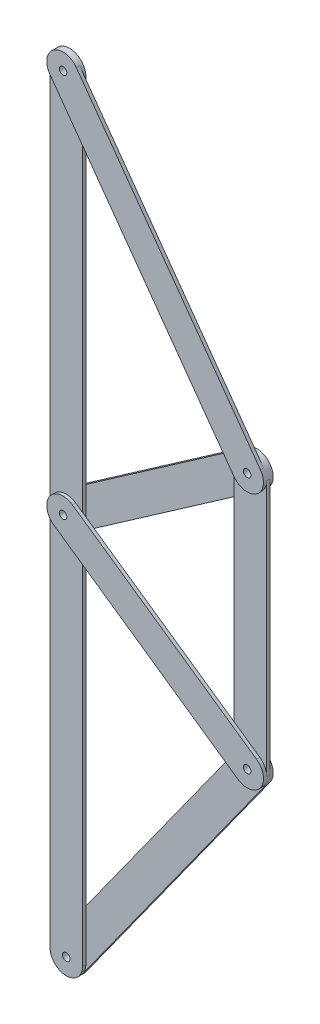
ISO-10303-21;
HEADER;
FILE_DESCRIPTION(('STEP AP214'),'2;1');
FILE_NAME('part.step','',(''),(''),'','','');
FILE_SCHEMA(('AUTOMOTIVE_DESIGN { 1 0 10303 214 1 1 1 1 }'));
ENDSEC;
DATA;
#1=APPLICATION_CONTEXT('core data for automotive mechanical design processes');
#2=APPLICATION_PROTOCOL_DEFINITION('international standard','automotive_design',2000,#1);
#3=PRODUCT_CONTEXT('',#1,'mechanical');
#4=PRODUCT('Part','Part','',(#3));
#5=PRODUCT_RELATED_PRODUCT_CATEGORY('part','',(#4));
#6=PRODUCT_DEFINITION_FORMATION('','',#4);
#7=PRODUCT_DEFINITION_CONTEXT('part definition',#1,'design');
#8=PRODUCT_DEFINITION('design','',#6,#7);
#9=PRODUCT_DEFINITION_SHAPE('','',#8);
#10=(LENGTH_UNIT() NAMED_UNIT(*) SI_UNIT(.MILLI.,.METRE.));
#11=(NAMED_UNIT(*) PLANE_ANGLE_UNIT() SI_UNIT($,.RADIAN.));
#12=(NAMED_UNIT(*) SI_UNIT($,.STERADIAN.) SOLID_ANGLE_UNIT());
#13=UNCERTAINTY_MEASURE_WITH_UNIT(LENGTH_MEASURE(1.E-05),#10,'distance_accuracy_value','');
#14=(GEOMETRIC_REPRESENTATION_CONTEXT(3) GLOBAL_UNCERTAINTY_ASSIGNED_CONTEXT((#13)) GLOBAL_UNIT_ASSIGNED_CONTEXT((#10,
#11,#12)) REPRESENTATION_CONTEXT('',''));
#15=CARTESIAN_POINT('',(0.,0.,0.));
#16=DIRECTION('',(0.,0.,1.));
#17=DIRECTION('',(1.,0.,0.));
#18=AXIS2_PLACEMENT_3D('',#15,#16,#17);
#19=CARTESIAN_POINT('',(-254.92135,-354.92135,0.));
#20=DIRECTION('',(0.,0.,1.));
#21=DIRECTION('',(1.,0.,0.));
#22=AXIS2_PLACEMENT_3D('',#19,#20,#21);
#23=PLANE('',#22);
#24=CARTESIAN_POINT('',(-254.92135,177.460675,0.));
#25=DIRECTION('',(0.,0.,1.));
#26=DIRECTION('',(1.,0.,0.));
#27=AXIS2_PLACEMENT_3D('',#24,#25,#26);
#28=CIRCLE('',#27,22.539325);
#29=CARTESIAN_POINT('',(-277.460675,177.460675,0.));
#30=VERTEX_POINT('',#29);
#31=CARTESIAN_POINT('',(-242.04387482363,158.962247917202,0.));
#32=VERTEX_POINT('',#31);
#33=EDGE_CURVE('E340',#30,#32,#28,.T.);
#34=ORIENTED_EDGE('',*,*,#33,.T.);
#35=DIRECTION('',(0.820717882314501,0.571333665776139,0.));
#36=VECTOR('',#35,1.);
#37=CARTESIAN_POINT('',(-242.04387482363,158.962247917202,0.));
#38=LINE('',#37,#36);
#39=CARTESIAN_POINT('',(-232.382025,165.688237684046,0.));
#40=VERTEX_POINT('',#39);
#41=EDGE_CURVE('E337',#32,#40,#38,.T.);
#42=ORIENTED_EDGE('',*,*,#41,.T.);
#43=DIRECTION('',(0.,1.,0.));
#44=VECTOR('',#43,1.);
#45=CARTESIAN_POINT('',(-232.382025,-354.92135,0.));
#46=LINE('',#45,#44);
#47=CARTESIAN_POINT('',(-232.382025,-284.903725445802,0.));
#48=VERTEX_POINT('',#47);
#49=EDGE_CURVE('E438',#48,#40,#46,.T.);
#50=ORIENTED_EDGE('',*,*,#49,.F.);
#51=DIRECTION('',(0.583366870900756,0.812208774845151,0.));
#52=VECTOR('',#51,1.);
#53=CARTESIAN_POINT('',(-273.227987544087,-341.772654502535,0.));
#54=LINE('',#53,#52);
#55=CARTESIAN_POINT('',(-273.227987544087,-341.772654502535,0.));
#56=VERTEX_POINT('',#55);
#57=EDGE_CURVE('E466',#56,#48,#54,.T.);
#58=ORIENTED_EDGE('',*,*,#57,.F.);
#59=CARTESIAN_POINT('',(-254.92135,-354.92135,0.));
#60=DIRECTION('',(0.,0.,1.));
#61=DIRECTION('',(1.,0.,0.));
#62=AXIS2_PLACEMENT_3D('',#59,#60,#61);
#63=CIRCLE('',#62,22.539325);
#64=CARTESIAN_POINT('',(-277.460675,-354.92135,0.));
#65=VERTEX_POINT('',#64);
#66=EDGE_CURVE('E449',#56,#65,#63,.T.);
#67=ORIENTED_EDGE('',*,*,#66,.T.);
#68=DIRECTION('',(0.,1.,0.));
#69=VECTOR('',#68,1.);
#70=CARTESIAN_POINT('',(-277.460675,-354.92135,0.));
#71=LINE('',#70,#69);
#72=EDGE_CURVE('E417',#65,#30,#71,.T.);
#73=ORIENTED_EDGE('',*,*,#72,.T.);
#74=EDGE_LOOP('',(#34,#42,#50,#58,#67,#73));
#75=FACE_BOUND('',#74,.T.);
#76=ADVANCED_FACE('F66',(#75),#23,.F.);
#77=CARTESIAN_POINT('',(0.,0.,4.50787));
#78=DIRECTION('',(0.,0.,1.));
#79=DIRECTION('',(1.,0.,0.));
#80=AXIS2_PLACEMENT_3D('',#77,#78,#79);
#81=PLANE('',#80);
#82=CARTESIAN_POINT('',(0.,354.92135,4.50787));
#83=DIRECTION('',(0.,0.,1.));
#84=DIRECTION('',(1.,0.,0.));
#85=AXIS2_PLACEMENT_3D('',#82,#83,#84);
#86=CIRCLE('',#85,22.5393250000002);
#87=CARTESIAN_POINT('',(-18.3066375440868,341.772654502535,4.50787));
#88=VERTEX_POINT('',#87);
#89=CARTESIAN_POINT('',(22.539325,354.92135,4.50787));
#90=VERTEX_POINT('',#89);
#91=EDGE_CURVE('E90',#88,#90,#86,.T.);
#92=ORIENTED_EDGE('',*,*,#91,.F.);
#93=DIRECTION('',(0.583366870900756,-0.812208774845151,0.));
#94=VECTOR('',#93,1.);
#95=CARTESIAN_POINT('',(-273.227987544087,696.694004502535,4.50787));
#96=LINE('',#95,#94);
#97=CARTESIAN_POINT('',(-22.539325,347.665731508367,4.50787));
#98=VERTEX_POINT('',#97);
#99=EDGE_CURVE('E751',#98,#88,#96,.T.);
#100=ORIENTED_EDGE('',*,*,#99,.F.);
#101=DIRECTION('',(0.,1.,0.));
#102=VECTOR('',#101,1.);
#103=CARTESIAN_POINT('',(-22.539325,0.,4.50787));
#104=LINE('',#103,#102);
#105=CARTESIAN_POINT('',(-22.539325,43.1534403472373,4.50787));
#106=VERTEX_POINT('',#105);
#107=EDGE_CURVE('E513',#106,#98,#104,.T.);
#108=ORIENTED_EDGE('',*,*,#107,.F.);
#109=DIRECTION('',(0.820717882314501,-0.571333665776138,0.));
#110=VECTOR('',#109,1.);
#111=CARTESIAN_POINT('',(12.8774751763698,18.4984270827983,4.50787));
#112=LINE('',#111,#110);
#113=CARTESIAN_POINT('',(12.8774751763698,18.4984270827983,4.50787));
#114=VERTEX_POINT('',#113);
#115=EDGE_CURVE('E395',#106,#114,#112,.T.);
#116=ORIENTED_EDGE('',*,*,#115,.T.);
#117=CARTESIAN_POINT('',(0.,0.,4.50787));
#118=DIRECTION('',(0.,0.,1.));
#119=DIRECTION('',(1.,0.,0.));
#120=AXIS2_PLACEMENT_3D('',#117,#118,#119);
#121=CIRCLE('',#120,22.539325);
#122=CARTESIAN_POINT('',(22.539325,0.,4.50787));
#123=VERTEX_POINT('',#122);
#124=EDGE_CURVE('E390',#123,#114,#121,.T.);
#125=ORIENTED_EDGE('',*,*,#124,.F.);
#126=DIRECTION('',(0.,1.,0.));
#127=VECTOR('',#126,1.);
#128=CARTESIAN_POINT('',(22.539325,0.,4.50787));
#129=LINE('',#128,#127);
#130=EDGE_CURVE('E512',#123,#90,#129,.T.);
#131=ORIENTED_EDGE('',*,*,#130,.T.);
#132=EDGE_LOOP('',(#92,#100,#108,#116,#125,#131));
#133=FACE_BOUND('',#132,.T.);
#134=ADVANCED_FACE('F670',(#133),#81,.T.);
#135=CARTESIAN_POINT('',(-254.92135,-354.92135,4.50787));
#136=DIRECTION('',(0.,0.,1.));
#137=DIRECTION('',(1.,0.,0.));
#138=AXIS2_PLACEMENT_3D('',#135,#136,#137);
#139=PLANE('',#138);
#140=CARTESIAN_POINT('',(-254.92135,-354.92135,4.50787));
#141=DIRECTION('',(0.,0.,1.));
#142=DIRECTION('',(1.,0.,0.));
#143=AXIS2_PLACEMENT_3D('',#140,#141,#142);
#144=CIRCLE('',#143,5.21119100000001);
#145=CARTESIAN_POINT('',(-249.710159,-354.92135,4.50787));
#146=VERTEX_POINT('',#145);
#147=EDGE_CURVE('E548',#146,#146,#144,.T.);
#148=ORIENTED_EDGE('',*,*,#147,.F.);
#149=EDGE_LOOP('',(#148));
#150=FACE_BOUND('',#149,.T.);
#151=DIRECTION('',(0.820717882314501,-0.571333665776138,0.));
#152=VECTOR('',#151,1.);
#153=CARTESIAN_POINT('',(-12.8774751763698,-18.4984270827983,4.50787));
#154=LINE('',#153,#152);
#155=CARTESIAN_POINT('',(-267.79882517637,158.962247917202,4.50787));
#156=VERTEX_POINT('',#155);
#157=CARTESIAN_POINT('',(-232.382025,134.307234652763,4.50787));
#158=VERTEX_POINT('',#157);
#159=EDGE_CURVE('E382',#156,#158,#154,.T.);
#160=ORIENTED_EDGE('',*,*,#159,.F.);
#161=CARTESIAN_POINT('',(-254.92135,177.460675,4.50787));
#162=DIRECTION('',(0.,0.,1.));
#163=DIRECTION('',(1.,0.,0.));
#164=AXIS2_PLACEMENT_3D('',#161,#162,#163);
#165=CIRCLE('',#164,22.539325);
#166=CARTESIAN_POINT('',(-277.460675,177.460675,4.50787));
#167=VERTEX_POINT('',#166);
#168=EDGE_CURVE('E12',#167,#156,#165,.T.);
#169=ORIENTED_EDGE('',*,*,#168,.F.);
#170=DIRECTION('',(0.,1.,0.));
#171=VECTOR('',#170,1.);
#172=CARTESIAN_POINT('',(-277.460675,-354.92135,4.50787));
#173=LINE('',#172,#171);
#174=CARTESIAN_POINT('',(-277.460675,-354.92135,4.50787));
#175=VERTEX_POINT('',#174);
#176=EDGE_CURVE('E421',#175,#167,#173,.T.);
#177=ORIENTED_EDGE('',*,*,#176,.F.);
#178=CARTESIAN_POINT('',(-254.92135,-354.92135,4.50787));
#179=DIRECTION('',(0.,0.,1.));
#180=DIRECTION('',(1.,0.,0.));
#181=AXIS2_PLACEMENT_3D('',#178,#179,#180);
#182=CIRCLE('',#181,22.5393249999999);
#183=CARTESIAN_POINT('',(-232.382025,-354.92135,4.50787));
#184=VERTEX_POINT('',#183);
#185=EDGE_CURVE('E412',#175,#184,#182,.T.);
#186=ORIENTED_EDGE('',*,*,#185,.T.);
#187=DIRECTION('',(0.,1.,0.));
#188=VECTOR('',#187,1.);
#189=CARTESIAN_POINT('',(-232.382025,-354.92135,4.50787));
#190=LINE('',#189,#188);
#191=EDGE_CURVE('E306',#184,#158,#190,.T.);
#192=ORIENTED_EDGE('',*,*,#191,.T.);
#193=EDGE_LOOP('',(#160,#169,#177,#186,#192));
#194=FACE_BOUND('',#193,.T.);
#195=ADVANCED_FACE('F631',(#150,#194),#139,.T.);
#196=CARTESIAN_POINT('',(0.,0.,4.50787));
#197=DIRECTION('',(0.,0.,-1.));
#198=DIRECTION('',(-1.,0.,0.));
#199=AXIS2_PLACEMENT_3D('',#196,#197,#198);
#200=CYLINDRICAL_SURFACE('',#199,22.539325);
#201=CARTESIAN_POINT('',(0.,0.,0.));
#202=DIRECTION('',(0.,0.,1.));
#203=DIRECTION('',(1.,0.,0.));
#204=AXIS2_PLACEMENT_3D('',#201,#202,#203);
#205=CIRCLE('',#204,22.539325);
#206=CARTESIAN_POINT('',(-22.539325,0.,0.));
#207=VERTEX_POINT('',#206);
#208=CARTESIAN_POINT('',(18.3066375440867,-13.1486954974652,0.));
#209=VERTEX_POINT('',#208);
#210=EDGE_CURVE('E497',#207,#209,#205,.T.);
#211=ORIENTED_EDGE('',*,*,#210,.T.);
#212=DIRECTION('',(0.,0.,1.));
#213=VECTOR('',#212,1.);
#214=CARTESIAN_POINT('',(18.3066375440867,-13.1486954974652,-4.50787));
#215=LINE('',#214,#213);
#216=CARTESIAN_POINT('',(18.3066375440867,-13.1486954974652,-4.50787));
#217=VERTEX_POINT('',#216);
#218=EDGE_CURVE('E501',#217,#209,#215,.T.);
#219=ORIENTED_EDGE('',*,*,#218,.F.);
#220=CARTESIAN_POINT('',(0.,0.,-4.50787));
#221=DIRECTION('',(0.,0.,1.));
#222=DIRECTION('',(1.,0.,0.));
#223=AXIS2_PLACEMENT_3D('',#220,#221,#222);
#224=CIRCLE('',#223,22.539325);
#225=CARTESIAN_POINT('',(-18.3066375440867,13.1486954974652,-4.50787));
#226=VERTEX_POINT('',#225);
#227=EDGE_CURVE('E472',#217,#226,#224,.T.);
#228=ORIENTED_EDGE('',*,*,#227,.T.);
#229=DIRECTION('',(0.,0.,1.));
#230=VECTOR('',#229,1.);
#231=CARTESIAN_POINT('',(-18.3066375440867,13.1486954974652,-4.50787));
#232=LINE('',#231,#230);
#233=CARTESIAN_POINT('',(-18.3066375440867,13.1486954974652,0.));
#234=VERTEX_POINT('',#233);
#235=EDGE_CURVE('E500',#226,#234,#232,.T.);
#236=ORIENTED_EDGE('',*,*,#235,.T.);
#237=CARTESIAN_POINT('',(0.,0.,0.));
#238=DIRECTION('',(0.,0.,1.));
#239=DIRECTION('',(1.,0.,0.));
#240=AXIS2_PLACEMENT_3D('',#237,#238,#239);
#241=CIRCLE('',#240,22.539325);
#242=CARTESIAN_POINT('',(22.539325,0.,0.));
#243=VERTEX_POINT('',#242);
#244=EDGE_CURVE('E79',#243,#234,#241,.T.);
#245=ORIENTED_EDGE('',*,*,#244,.F.);
#246=DIRECTION('',(0.,0.,-1.));
#247=VECTOR('',#246,1.);
#248=CARTESIAN_POINT('',(22.539325,0.,4.50787));
#249=LINE('',#248,#247);
#250=EDGE_CURVE('E541',#123,#243,#249,.T.);
#251=ORIENTED_EDGE('',*,*,#250,.F.);
#252=ORIENTED_EDGE('',*,*,#124,.T.);
#253=DIRECTION('',(0.,0.,-1.));
#254=VECTOR('',#253,1.);
#255=CARTESIAN_POINT('',(12.8774751763698,18.4984270827983,9.01574));
#256=LINE('',#255,#254);
#257=CARTESIAN_POINT('',(12.8774751763698,18.4984270827983,9.01574));
#258=VERTEX_POINT('',#257);
#259=EDGE_CURVE('E403',#258,#114,#256,.T.);
#260=ORIENTED_EDGE('',*,*,#259,.F.);
#261=CARTESIAN_POINT('',(0.,0.,9.01574));
#262=DIRECTION('',(0.,0.,1.));
#263=DIRECTION('',(1.,0.,0.));
#264=AXIS2_PLACEMENT_3D('',#261,#262,#263);
#265=CIRCLE('',#264,22.539325);
#266=CARTESIAN_POINT('',(-12.8774751763698,-18.4984270827983,9.01574));
#267=VERTEX_POINT('',#266);
#268=EDGE_CURVE('E375',#267,#258,#265,.T.);
#269=ORIENTED_EDGE('',*,*,#268,.F.);
#270=DIRECTION('',(0.,0.,-1.));
#271=VECTOR('',#270,1.);
#272=CARTESIAN_POINT('',(-12.8774751763698,-18.4984270827983,9.01574));
#273=LINE('',#272,#271);
#274=CARTESIAN_POINT('',(-12.8774751763698,-18.4984270827983,4.50787));
#275=VERTEX_POINT('',#274);
#276=EDGE_CURVE('E408',#267,#275,#273,.T.);
#277=ORIENTED_EDGE('',*,*,#276,.T.);
#278=CARTESIAN_POINT('',(0.,0.,4.50787));
#279=DIRECTION('',(0.,0.,1.));
#280=DIRECTION('',(1.,0.,0.));
#281=AXIS2_PLACEMENT_3D('',#278,#279,#280);
#282=CIRCLE('',#281,22.539325);
#283=CARTESIAN_POINT('',(-22.539325,0.,4.50787));
#284=VERTEX_POINT('',#283);
#285=EDGE_CURVE('E506',#284,#275,#282,.T.);
#286=ORIENTED_EDGE('',*,*,#285,.F.);
#287=DIRECTION('',(0.,0.,-1.));
#288=VECTOR('',#287,1.);
#289=CARTESIAN_POINT('',(-22.539325,0.,4.50787));
#290=LINE('',#289,#288);
#291=EDGE_CURVE('E519',#284,#207,#290,.T.);
#292=ORIENTED_EDGE('',*,*,#291,.T.);
#293=EDGE_LOOP('',(#211,#219,#228,#236,#245,#251,#252,#260,#269,#277,#286,#292));
#294=FACE_BOUND('',#293,.T.);
#295=ADVANCED_FACE('F69',(#294),#200,.T.);
#296=CARTESIAN_POINT('',(22.539325,0.,4.50787));
#297=DIRECTION('',(-1.,0.,0.));
#298=DIRECTION('',(0.,0.,1.));
#299=AXIS2_PLACEMENT_3D('',#296,#297,#298);
#300=PLANE('',#299);
#301=DIRECTION('',(0.,1.,0.));
#302=VECTOR('',#301,1.);
#303=CARTESIAN_POINT('',(22.539325,0.,0.));
#304=LINE('',#303,#302);
#305=CARTESIAN_POINT('',(22.5393249999999,354.92135,0.));
#306=VERTEX_POINT('',#305);
#307=EDGE_CURVE('E521',#243,#306,#304,.T.);
#308=ORIENTED_EDGE('',*,*,#307,.T.);
#309=DIRECTION('',(0.,0.,-1.));
#310=VECTOR('',#309,1.);
#311=CARTESIAN_POINT('',(22.539325,354.92135,4.50787));
#312=LINE('',#311,#310);
#313=EDGE_CURVE('E540',#90,#306,#312,.T.);
#314=ORIENTED_EDGE('',*,*,#313,.F.);
#315=ORIENTED_EDGE('',*,*,#130,.F.);
#316=ORIENTED_EDGE('',*,*,#250,.T.);
#317=EDGE_LOOP('',(#308,#314,#315,#316));
#318=FACE_BOUND('',#317,.T.);
#319=ADVANCED_FACE('F679',(#318),#300,.F.);
#320=CARTESIAN_POINT('',(0.,354.92135,4.50787));
#321=DIRECTION('',(0.,0.,-1.));
#322=DIRECTION('',(-1.,0.,0.));
#323=AXIS2_PLACEMENT_3D('',#320,#321,#322);
#324=CYLINDRICAL_SURFACE('',#323,22.539325);
#325=ORIENTED_EDGE('',*,*,#313,.T.);
#326=CARTESIAN_POINT('',(0.,354.92135,0.));
#327=DIRECTION('',(0.,0.,1.));
#328=DIRECTION('',(1.,0.,0.));
#329=AXIS2_PLACEMENT_3D('',#326,#327,#328);
#330=CIRCLE('',#329,22.5393249999999);
#331=CARTESIAN_POINT('',(12.8774751763697,336.422922917202,0.));
#332=VERTEX_POINT('',#331);
#333=EDGE_CURVE('E343',#332,#306,#330,.T.);
#334=ORIENTED_EDGE('',*,*,#333,.F.);
#335=DIRECTION('',(0.,0.,1.));
#336=VECTOR('',#335,1.);
#337=CARTESIAN_POINT('',(12.8774751763697,336.422922917202,-4.50787));
#338=LINE('',#337,#336);
#339=CARTESIAN_POINT('',(12.8774751763697,336.422922917202,-4.50787));
#340=VERTEX_POINT('',#339);
#341=EDGE_CURVE('E356',#340,#332,#338,.T.);
#342=ORIENTED_EDGE('',*,*,#341,.F.);
#343=CARTESIAN_POINT('',(0.,354.92135,-4.50787));
#344=DIRECTION('',(0.,0.,1.));
#345=DIRECTION('',(1.,0.,0.));
#346=AXIS2_PLACEMENT_3D('',#343,#344,#345);
#347=CIRCLE('',#346,22.5393249999999);
#348=CARTESIAN_POINT('',(-12.8774751763697,373.419777082798,-4.50787));
#349=VERTEX_POINT('',#348);
#350=EDGE_CURVE('E324',#340,#349,#347,.T.);
#351=ORIENTED_EDGE('',*,*,#350,.T.);
#352=DIRECTION('',(0.,0.,1.));
#353=VECTOR('',#352,1.);
#354=CARTESIAN_POINT('',(-12.8774751763697,373.419777082798,-4.50787));
#355=LINE('',#354,#353);
#356=CARTESIAN_POINT('',(-12.8774751763697,373.419777082798,0.));
#357=VERTEX_POINT('',#356);
#358=EDGE_CURVE('E353',#349,#357,#355,.T.);
#359=ORIENTED_EDGE('',*,*,#358,.T.);
#360=CARTESIAN_POINT('',(0.,354.92135,0.));
#361=DIRECTION('',(0.,0.,1.));
#362=DIRECTION('',(1.,0.,0.));
#363=AXIS2_PLACEMENT_3D('',#360,#361,#362);
#364=CIRCLE('',#363,22.539325);
#365=CARTESIAN_POINT('',(-22.539325,354.92135,0.));
#366=VERTEX_POINT('',#365);
#367=EDGE_CURVE('E352',#357,#366,#364,.T.);
#368=ORIENTED_EDGE('',*,*,#367,.T.);
#369=DIRECTION('',(0.,0.,-1.));
#370=VECTOR('',#369,1.);
#371=CARTESIAN_POINT('',(-22.539325,354.92135,4.50787));
#372=LINE('',#371,#370);
#373=CARTESIAN_POINT('',(-22.539325,354.92135,4.50787));
#374=VERTEX_POINT('',#373);
#375=EDGE_CURVE('E531',#374,#366,#372,.T.);
#376=ORIENTED_EDGE('',*,*,#375,.F.);
#377=CARTESIAN_POINT('',(0.,354.92135,4.50787));
#378=DIRECTION('',(0.,0.,1.));
#379=DIRECTION('',(1.,0.,0.));
#380=AXIS2_PLACEMENT_3D('',#377,#378,#379);
#381=CIRCLE('',#380,22.539325);
#382=CARTESIAN_POINT('',(18.3066375440867,368.070045497465,4.50787));
#383=VERTEX_POINT('',#382);
#384=EDGE_CURVE('E100',#383,#374,#381,.T.);
#385=ORIENTED_EDGE('',*,*,#384,.F.);
#386=DIRECTION('',(0.,0.,-1.));
#387=VECTOR('',#386,1.);
#388=CARTESIAN_POINT('',(18.3066375440868,368.070045497465,9.01574));
#389=LINE('',#388,#387);
#390=CARTESIAN_POINT('',(18.3066375440868,368.070045497465,9.01574));
#391=VERTEX_POINT('',#390);
#392=EDGE_CURVE('E310',#391,#383,#389,.T.);
#393=ORIENTED_EDGE('',*,*,#392,.F.);
#394=CARTESIAN_POINT('',(0.,354.92135,9.01574));
#395=DIRECTION('',(0.,0.,1.));
#396=DIRECTION('',(1.,0.,0.));
#397=AXIS2_PLACEMENT_3D('',#394,#395,#396);
#398=CIRCLE('',#397,22.5393250000002);
#399=CARTESIAN_POINT('',(-18.3066375440868,341.772654502535,9.01574));
#400=VERTEX_POINT('',#399);
#401=EDGE_CURVE('E285',#400,#391,#398,.T.);
#402=ORIENTED_EDGE('',*,*,#401,.F.);
#403=DIRECTION('',(0.,0.,-1.));
#404=VECTOR('',#403,1.);
#405=CARTESIAN_POINT('',(-18.3066375440868,341.772654502535,9.01574));
#406=LINE('',#405,#404);
#407=EDGE_CURVE('E279',#400,#88,#406,.T.);
#408=ORIENTED_EDGE('',*,*,#407,.T.);
#409=ORIENTED_EDGE('',*,*,#91,.T.);
#410=EDGE_LOOP('',(#325,#334,#342,#351,#359,#368,#376,#385,#393,#402,#408,#409));
#411=FACE_BOUND('',#410,.T.);
#412=ADVANCED_FACE('F677',(#411),#324,.T.);
#413=CARTESIAN_POINT('',(-22.539325,0.,4.50787));
#414=DIRECTION('',(-1.,0.,0.));
#415=DIRECTION('',(0.,0.,1.));
#416=AXIS2_PLACEMENT_3D('',#413,#414,#415);
#417=PLANE('',#416);
#418=DIRECTION('',(0.,1.,0.));
#419=VECTOR('',#418,1.);
#420=CARTESIAN_POINT('',(-22.539325,0.,0.));
#421=LINE('',#420,#419);
#422=CARTESIAN_POINT('',(-22.539325,7.25561849163252,0.));
#423=VERTEX_POINT('',#422);
#424=EDGE_CURVE('E515',#207,#423,#421,.T.);
#425=ORIENTED_EDGE('',*,*,#424,.F.);
#426=ORIENTED_EDGE('',*,*,#291,.F.);
#427=EDGE_CURVE('E516',#284,#106,#104,.T.);
#428=ORIENTED_EDGE('',*,*,#427,.T.);
#429=ORIENTED_EDGE('',*,*,#107,.T.);
#430=EDGE_CURVE('E312',#98,#374,#104,.T.);
#431=ORIENTED_EDGE('',*,*,#430,.T.);
#432=ORIENTED_EDGE('',*,*,#375,.T.);
#433=CARTESIAN_POINT('',(-22.539325,311.767909652763,0.));
#434=VERTEX_POINT('',#433);
#435=EDGE_CURVE('E370',#434,#366,#421,.T.);
#436=ORIENTED_EDGE('',*,*,#435,.F.);
#437=EDGE_CURVE('E527',#423,#434,#421,.T.);
#438=ORIENTED_EDGE('',*,*,#437,.F.);
#439=EDGE_LOOP('',(#425,#426,#428,#429,#431,#432,#436,#438));
#440=FACE_BOUND('',#439,.T.);
#441=ADVANCED_FACE('F675',(#440),#417,.T.);
#442=CARTESIAN_POINT('',(0.,0.,0.));
#443=DIRECTION('',(0.,0.,1.));
#444=DIRECTION('',(1.,0.,0.));
#445=AXIS2_PLACEMENT_3D('',#442,#443,#444);
#446=PLANE('',#445);
#447=ORIENTED_EDGE('',*,*,#437,.T.);
#448=EDGE_CURVE('E336',#434,#332,#38,.T.);
#449=ORIENTED_EDGE('',*,*,#448,.T.);
#450=ORIENTED_EDGE('',*,*,#333,.T.);
#451=ORIENTED_EDGE('',*,*,#307,.F.);
#452=ORIENTED_EDGE('',*,*,#244,.T.);
#453=EDGE_CURVE('E487',#423,#234,#54,.T.);
#454=ORIENTED_EDGE('',*,*,#453,.F.);
#455=EDGE_LOOP('',(#447,#449,#450,#451,#452,#454));
#456=FACE_BOUND('',#455,.T.);
#457=ADVANCED_FACE('F654',(#456),#446,.F.);
#458=CARTESIAN_POINT('',(-254.92135,-354.92135,0.));
#459=DIRECTION('',(0.,0.,1.));
#460=DIRECTION('',(1.,0.,0.));
#461=AXIS2_PLACEMENT_3D('',#458,#459,#460);
#462=PLANE('',#461);
#463=CARTESIAN_POINT('',(-232.382025,-354.92135,0.));
#464=VERTEX_POINT('',#463);
#465=EDGE_CURVE('E432',#464,#48,#46,.T.);
#466=ORIENTED_EDGE('',*,*,#465,.F.);
#467=CARTESIAN_POINT('',(-254.92135,-354.92135,0.));
#468=DIRECTION('',(0.,0.,1.));
#469=DIRECTION('',(1.,0.,0.));
#470=AXIS2_PLACEMENT_3D('',#467,#468,#469);
#471=CIRCLE('',#470,22.5393249999999);
#472=CARTESIAN_POINT('',(-236.614712455913,-368.070045497465,0.));
#473=VERTEX_POINT('',#472);
#474=EDGE_CURVE('E428',#473,#464,#471,.T.);
#475=ORIENTED_EDGE('',*,*,#474,.F.);
#476=DIRECTION('',(0.583366870900756,0.812208774845151,0.));
#477=VECTOR('',#476,1.);
#478=CARTESIAN_POINT('',(-236.614712455913,-368.070045497465,0.));
#479=LINE('',#478,#477);
#480=EDGE_CURVE('E485',#473,#209,#479,.T.);
#481=ORIENTED_EDGE('',*,*,#480,.T.);
#482=ORIENTED_EDGE('',*,*,#210,.F.);
#483=ORIENTED_EDGE('',*,*,#424,.T.);
#484=EDGE_CURVE('E486',#48,#423,#54,.T.);
#485=ORIENTED_EDGE('',*,*,#484,.F.);
#486=EDGE_LOOP('',(#466,#475,#481,#482,#483,#485));
#487=FACE_BOUND('',#486,.T.);
#488=ADVANCED_FACE('F651',(#487),#462,.T.);
#489=CARTESIAN_POINT('',(-254.92135,-354.92135,-4.50787));
#490=DIRECTION('',(0.,0.,1.));
#491=DIRECTION('',(1.,0.,0.));
#492=AXIS2_PLACEMENT_3D('',#489,#490,#491);
#493=CYLINDRICAL_SURFACE('',#492,22.539325);
#494=ORIENTED_EDGE('',*,*,#66,.F.);
#495=DIRECTION('',(0.,0.,1.));
#496=VECTOR('',#495,1.);
#497=CARTESIAN_POINT('',(-273.227987544087,-341.772654502535,-4.50787));
#498=LINE('',#497,#496);
#499=CARTESIAN_POINT('',(-273.227987544087,-341.772654502535,-4.50787));
#500=VERTEX_POINT('',#499);
#501=EDGE_CURVE('E492',#500,#56,#498,.T.);
#502=ORIENTED_EDGE('',*,*,#501,.F.);
#503=CARTESIAN_POINT('',(-254.92135,-354.92135,-4.50787));
#504=DIRECTION('',(0.,0.,1.));
#505=DIRECTION('',(1.,0.,0.));
#506=AXIS2_PLACEMENT_3D('',#503,#504,#505);
#507=CIRCLE('',#506,22.539325);
#508=CARTESIAN_POINT('',(-236.614712455913,-368.070045497465,-4.50787));
#509=VERTEX_POINT('',#508);
#510=EDGE_CURVE('E462',#500,#509,#507,.T.);
#511=ORIENTED_EDGE('',*,*,#510,.T.);
#512=DIRECTION('',(0.,0.,1.));
#513=VECTOR('',#512,1.);
#514=CARTESIAN_POINT('',(-236.614712455913,-368.070045497465,-4.50787));
#515=LINE('',#514,#513);
#516=EDGE_CURVE('E479',#509,#473,#515,.T.);
#517=ORIENTED_EDGE('',*,*,#516,.T.);
#518=ORIENTED_EDGE('',*,*,#474,.T.);
#519=DIRECTION('',(0.,0.,-1.));
#520=VECTOR('',#519,1.);
#521=CARTESIAN_POINT('',(-232.382025,-354.92135,4.50787));
#522=LINE('',#521,#520);
#523=EDGE_CURVE('E446',#184,#464,#522,.T.);
#524=ORIENTED_EDGE('',*,*,#523,.F.);
#525=ORIENTED_EDGE('',*,*,#185,.F.);
#526=DIRECTION('',(0.,0.,-1.));
#527=VECTOR('',#526,1.);
#528=CARTESIAN_POINT('',(-277.460675,-354.92135,4.50787));
#529=LINE('',#528,#527);
#530=EDGE_CURVE('E430',#175,#65,#529,.T.);
#531=ORIENTED_EDGE('',*,*,#530,.T.);
#532=EDGE_LOOP('',(#494,#502,#511,#517,#518,#524,#525,#531));
#533=FACE_BOUND('',#532,.T.);
#534=ADVANCED_FACE('F652',(#533),#493,.T.);
#535=CARTESIAN_POINT('',(-273.227987544087,-341.772654502535,-4.50787));
#536=DIRECTION('',(0.812208774845151,-0.583366870900756,0.));
#537=DIRECTION('',(0.583366870900756,0.812208774845151,0.));
#538=AXIS2_PLACEMENT_3D('',#535,#536,#537);
#539=PLANE('',#538);
#540=ORIENTED_EDGE('',*,*,#57,.T.);
#541=ORIENTED_EDGE('',*,*,#484,.T.);
#542=ORIENTED_EDGE('',*,*,#453,.T.);
#543=ORIENTED_EDGE('',*,*,#235,.F.);
#544=DIRECTION('',(0.583366870900756,0.812208774845151,0.));
#545=VECTOR('',#544,1.);
#546=CARTESIAN_POINT('',(-273.227987544087,-341.772654502535,-4.50787));
#547=LINE('',#546,#545);
#548=EDGE_CURVE('E478',#500,#226,#547,.T.);
#549=ORIENTED_EDGE('',*,*,#548,.F.);
#550=ORIENTED_EDGE('',*,*,#501,.T.);
#551=EDGE_LOOP('',(#540,#541,#542,#543,#549,#550));
#552=FACE_BOUND('',#551,.T.);
#553=ADVANCED_FACE('F660',(#552),#539,.F.);
#554=CARTESIAN_POINT('',(-236.614712455913,-368.070045497465,-4.50787));
#555=DIRECTION('',(0.812208774845151,-0.583366870900756,0.));
#556=DIRECTION('',(0.583366870900756,0.812208774845151,0.));
#557=AXIS2_PLACEMENT_3D('',#554,#555,#556);
#558=PLANE('',#557);
#559=ORIENTED_EDGE('',*,*,#480,.F.);
#560=ORIENTED_EDGE('',*,*,#516,.F.);
#561=DIRECTION('',(0.583366870900756,0.812208774845151,0.));
#562=VECTOR('',#561,1.);
#563=CARTESIAN_POINT('',(-236.614712455913,-368.070045497465,-4.50787));
#564=LINE('',#563,#562);
#565=EDGE_CURVE('E470',#509,#217,#564,.T.);
#566=ORIENTED_EDGE('',*,*,#565,.T.);
#567=ORIENTED_EDGE('',*,*,#218,.T.);
#568=EDGE_LOOP('',(#559,#560,#566,#567));
#569=FACE_BOUND('',#568,.T.);
#570=ADVANCED_FACE('F647',(#569),#558,.T.);
#571=CARTESIAN_POINT('',(-254.92135,-354.92135,-4.50787));
#572=DIRECTION('',(0.,0.,1.));
#573=DIRECTION('',(1.,0.,0.));
#574=AXIS2_PLACEMENT_3D('',#571,#572,#573);
#575=PLANE('',#574);
#576=CARTESIAN_POINT('',(-254.92135,-354.92135,-4.50787));
#577=DIRECTION('',(0.,0.,1.));
#578=DIRECTION('',(1.,0.,0.));
#579=AXIS2_PLACEMENT_3D('',#576,#577,#578);
#580=CIRCLE('',#579,5.21119100000001);
#581=CARTESIAN_POINT('',(-249.710159,-354.92135,-4.50787));
#582=VERTEX_POINT('',#581);
#583=EDGE_CURVE('E834',#582,#582,#580,.T.);
#584=ORIENTED_EDGE('',*,*,#583,.T.);
#585=EDGE_LOOP('',(#584));
#586=FACE_BOUND('',#585,.T.);
#587=CARTESIAN_POINT('',(0.,0.,-4.50787));
#588=DIRECTION('',(0.,0.,1.));
#589=DIRECTION('',(1.,0.,0.));
#590=AXIS2_PLACEMENT_3D('',#587,#588,#589);
#591=CIRCLE('',#590,5.211191);
#592=CARTESIAN_POINT('',(5.211191,0.,-4.50787));
#593=VERTEX_POINT('',#592);
#594=EDGE_CURVE('E549',#593,#593,#591,.T.);
#595=ORIENTED_EDGE('',*,*,#594,.T.);
#596=EDGE_LOOP('',(#595));
#597=FACE_BOUND('',#596,.T.);
#598=ORIENTED_EDGE('',*,*,#510,.F.);
#599=ORIENTED_EDGE('',*,*,#548,.T.);
#600=ORIENTED_EDGE('',*,*,#227,.F.);
#601=ORIENTED_EDGE('',*,*,#565,.F.);
#602=EDGE_LOOP('',(#598,#599,#600,#601));
#603=FACE_BOUND('',#602,.T.);
#604=ADVANCED_FACE('F637',(#586,#597,#603),#575,.F.);
#605=CARTESIAN_POINT('',(-254.92135,709.8427,0.));
#606=DIRECTION('',(0.,0.,1.));
#607=DIRECTION('',(1.,0.,0.));
#608=AXIS2_PLACEMENT_3D('',#605,#606,#607);
#609=CIRCLE('',#608,5.21119099999999);
#610=CARTESIAN_POINT('',(-249.710159,709.8427,0.));
#611=VERTEX_POINT('',#610);
#612=EDGE_CURVE('E544',#611,#611,#609,.T.);
#613=ORIENTED_EDGE('',*,*,#612,.T.);
#614=EDGE_LOOP('',(#613));
#615=FACE_BOUND('',#614,.T.);
#616=DIRECTION('',(0.820717882314502,0.571333665776138,0.));
#617=VECTOR('',#616,1.);
#618=CARTESIAN_POINT('',(-267.79882517637,195.959102082798,0.));
#619=LINE('',#618,#617);
#620=CARTESIAN_POINT('',(-267.79882517637,195.959102082798,0.));
#621=VERTEX_POINT('',#620);
#622=CARTESIAN_POINT('',(-232.382025,220.614115347237,0.));
#623=VERTEX_POINT('',#622);
#624=EDGE_CURVE('E321',#621,#623,#619,.T.);
#625=ORIENTED_EDGE('',*,*,#624,.F.);
#626=EDGE_CURVE('E334',#621,#30,#28,.T.);
#627=ORIENTED_EDGE('',*,*,#626,.T.);
#628=CARTESIAN_POINT('',(-277.460675,709.8427,0.));
#629=VERTEX_POINT('',#628);
#630=EDGE_CURVE('E437',#30,#629,#71,.T.);
#631=ORIENTED_EDGE('',*,*,#630,.T.);
#632=CARTESIAN_POINT('',(-254.92135,709.8427,0.));
#633=DIRECTION('',(0.,0.,1.));
#634=DIRECTION('',(1.,0.,0.));
#635=AXIS2_PLACEMENT_3D('',#632,#633,#634);
#636=CIRCLE('',#635,22.5393249999999);
#637=CARTESIAN_POINT('',(-232.382025,709.8427,0.));
#638=VERTEX_POINT('',#637);
#639=EDGE_CURVE('E411',#638,#629,#636,.T.);
#640=ORIENTED_EDGE('',*,*,#639,.F.);
#641=EDGE_CURVE('E435',#623,#638,#46,.T.);
#642=ORIENTED_EDGE('',*,*,#641,.F.);
#643=EDGE_LOOP('',(#625,#627,#631,#640,#642));
#644=FACE_BOUND('',#643,.T.);
#645=ADVANCED_FACE('F633',(#615,#644),#23,.F.);
#646=CARTESIAN_POINT('',(-254.92135,709.8427,4.50787));
#647=DIRECTION('',(0.,0.,1.));
#648=DIRECTION('',(1.,0.,0.));
#649=AXIS2_PLACEMENT_3D('',#646,#647,#648);
#650=CIRCLE('',#649,22.5393250000002);
#651=CARTESIAN_POINT('',(-277.460675,709.8427,4.50787));
#652=VERTEX_POINT('',#651);
#653=CARTESIAN_POINT('',(-273.227987544087,696.694004502535,4.50787));
#654=VERTEX_POINT('',#653);
#655=EDGE_CURVE('E298',#652,#654,#650,.T.);
#656=ORIENTED_EDGE('',*,*,#655,.F.);
#657=EDGE_CURVE('E423',#167,#652,#173,.T.);
#658=ORIENTED_EDGE('',*,*,#657,.F.);
#659=CARTESIAN_POINT('',(-242.04387482363,195.959102082798,4.50787));
#660=VERTEX_POINT('',#659);
#661=EDGE_CURVE('E85',#660,#167,#165,.T.);
#662=ORIENTED_EDGE('',*,*,#661,.F.);
#663=CARTESIAN_POINT('',(-232.382025,189.233112315954,4.50787));
#664=VERTEX_POINT('',#663);
#665=EDGE_CURVE('E392',#660,#664,#112,.T.);
#666=ORIENTED_EDGE('',*,*,#665,.T.);
#667=CARTESIAN_POINT('',(-232.382025,639.825075445801,4.50787));
#668=VERTEX_POINT('',#667);
#669=EDGE_CURVE('E307',#664,#668,#190,.T.);
#670=ORIENTED_EDGE('',*,*,#669,.T.);
#671=EDGE_CURVE('E742',#654,#668,#96,.T.);
#672=ORIENTED_EDGE('',*,*,#671,.F.);
#673=EDGE_LOOP('',(#656,#658,#662,#666,#670,#672));
#674=FACE_BOUND('',#673,.T.);
#675=ADVANCED_FACE('F630',(#674),#139,.T.);
#676=CARTESIAN_POINT('',(-277.460675,-354.92135,4.50787));
#677=DIRECTION('',(-1.,0.,0.));
#678=DIRECTION('',(0.,0.,1.));
#679=AXIS2_PLACEMENT_3D('',#676,#677,#678);
#680=PLANE('',#679);
#681=ORIENTED_EDGE('',*,*,#72,.F.);
#682=ORIENTED_EDGE('',*,*,#530,.F.);
#683=ORIENTED_EDGE('',*,*,#176,.T.);
#684=ORIENTED_EDGE('',*,*,#657,.T.);
#685=DIRECTION('',(0.,0.,-1.));
#686=VECTOR('',#685,1.);
#687=CARTESIAN_POINT('',(-277.460675,709.8427,4.50787));
#688=LINE('',#687,#686);
#689=EDGE_CURVE('E452',#652,#629,#688,.T.);
#690=ORIENTED_EDGE('',*,*,#689,.T.);
#691=ORIENTED_EDGE('',*,*,#630,.F.);
#692=EDGE_LOOP('',(#681,#682,#683,#684,#690,#691));
#693=FACE_BOUND('',#692,.T.);
#694=ADVANCED_FACE('F629',(#693),#680,.T.);
#695=CARTESIAN_POINT('',(-232.382025,-354.92135,4.50787));
#696=DIRECTION('',(-1.,0.,0.));
#697=DIRECTION('',(0.,0.,1.));
#698=AXIS2_PLACEMENT_3D('',#695,#696,#697);
#699=PLANE('',#698);
#700=ORIENTED_EDGE('',*,*,#465,.T.);
#701=ORIENTED_EDGE('',*,*,#49,.T.);
#702=EDGE_CURVE('E1147',#40,#623,#46,.T.);
#703=ORIENTED_EDGE('',*,*,#702,.T.);
#704=ORIENTED_EDGE('',*,*,#641,.T.);
#705=DIRECTION('',(0.,0.,-1.));
#706=VECTOR('',#705,1.);
#707=CARTESIAN_POINT('',(-232.382025,709.8427,4.50787));
#708=LINE('',#707,#706);
#709=CARTESIAN_POINT('',(-232.382025,709.8427,4.50787));
#710=VERTEX_POINT('',#709);
#711=EDGE_CURVE('E433',#710,#638,#708,.T.);
#712=ORIENTED_EDGE('',*,*,#711,.F.);
#713=EDGE_CURVE('E303',#668,#710,#190,.T.);
#714=ORIENTED_EDGE('',*,*,#713,.F.);
#715=ORIENTED_EDGE('',*,*,#669,.F.);
#716=EDGE_CURVE('E425',#158,#664,#190,.T.);
#717=ORIENTED_EDGE('',*,*,#716,.F.);
#718=ORIENTED_EDGE('',*,*,#191,.F.);
#719=ORIENTED_EDGE('',*,*,#523,.T.);
#720=EDGE_LOOP('',(#700,#701,#703,#704,#712,#714,#715,#717,#718,#719));
#721=FACE_BOUND('',#720,.T.);
#722=ADVANCED_FACE('F632',(#721),#699,.F.);
#723=CARTESIAN_POINT('',(-254.92135,709.8427,4.50787));
#724=DIRECTION('',(0.,0.,-1.));
#725=DIRECTION('',(-1.,0.,0.));
#726=AXIS2_PLACEMENT_3D('',#723,#724,#725);
#727=CYLINDRICAL_SURFACE('',#726,22.5393249999999);
#728=ORIENTED_EDGE('',*,*,#639,.T.);
#729=ORIENTED_EDGE('',*,*,#689,.F.);
#730=ORIENTED_EDGE('',*,*,#655,.T.);
#731=DIRECTION('',(0.,0.,-1.));
#732=VECTOR('',#731,1.);
#733=CARTESIAN_POINT('',(-273.227987544087,696.694004502535,9.01574));
#734=LINE('',#733,#732);
#735=CARTESIAN_POINT('',(-273.227987544087,696.694004502535,9.01574));
#736=VERTEX_POINT('',#735);
#737=EDGE_CURVE('E277',#736,#654,#734,.T.);
#738=ORIENTED_EDGE('',*,*,#737,.F.);
#739=CARTESIAN_POINT('',(-254.92135,709.8427,9.01574));
#740=DIRECTION('',(0.,0.,1.));
#741=DIRECTION('',(1.,0.,0.));
#742=AXIS2_PLACEMENT_3D('',#739,#740,#741);
#743=CIRCLE('',#742,22.5393250000002);
#744=CARTESIAN_POINT('',(-236.614712455913,722.991395497465,9.01574));
#745=VERTEX_POINT('',#744);
#746=EDGE_CURVE('E282',#745,#736,#743,.T.);
#747=ORIENTED_EDGE('',*,*,#746,.F.);
#748=DIRECTION('',(0.,0.,-1.));
#749=VECTOR('',#748,1.);
#750=CARTESIAN_POINT('',(-236.614712455913,722.991395497465,9.01574));
#751=LINE('',#750,#749);
#752=CARTESIAN_POINT('',(-236.614712455913,722.991395497465,4.50787));
#753=VERTEX_POINT('',#752);
#754=EDGE_CURVE('E770',#745,#753,#751,.T.);
#755=ORIENTED_EDGE('',*,*,#754,.T.);
#756=CARTESIAN_POINT('',(-254.92135,709.8427,4.50787));
#757=DIRECTION('',(0.,0.,1.));
#758=DIRECTION('',(1.,0.,0.));
#759=AXIS2_PLACEMENT_3D('',#756,#757,#758);
#760=CIRCLE('',#759,22.5393249999999);
#761=EDGE_CURVE('E453',#710,#753,#760,.T.);
#762=ORIENTED_EDGE('',*,*,#761,.F.);
#763=ORIENTED_EDGE('',*,*,#711,.T.);
#764=EDGE_LOOP('',(#728,#729,#730,#738,#747,#755,#762,#763));
#765=FACE_BOUND('',#764,.T.);
#766=ADVANCED_FACE('F300',(#765),#727,.T.);
#767=CARTESIAN_POINT('',(0.,0.,4.50787));
#768=DIRECTION('',(0.,0.,1.));
#769=DIRECTION('',(1.,0.,0.));
#770=AXIS2_PLACEMENT_3D('',#767,#768,#769);
#771=PLANE('',#770);
#772=ORIENTED_EDGE('',*,*,#427,.F.);
#773=ORIENTED_EDGE('',*,*,#285,.T.);
#774=EDGE_CURVE('E389',#158,#275,#154,.T.);
#775=ORIENTED_EDGE('',*,*,#774,.F.);
#776=ORIENTED_EDGE('',*,*,#716,.T.);
#777=EDGE_CURVE('E398',#664,#106,#112,.T.);
#778=ORIENTED_EDGE('',*,*,#777,.T.);
#779=EDGE_LOOP('',(#772,#773,#775,#776,#778));
#780=FACE_BOUND('',#779,.T.);
#781=ADVANCED_FACE('F611',(#780),#771,.F.);
#782=CARTESIAN_POINT('',(-12.8774751763698,-18.4984270827983,9.01574));
#783=DIRECTION('',(0.571333665776138,0.820717882314501,0.));
#784=DIRECTION('',(-0.820717882314501,0.571333665776138,0.));
#785=AXIS2_PLACEMENT_3D('',#782,#783,#784);
#786=PLANE('',#785);
#787=ORIENTED_EDGE('',*,*,#159,.T.);
#788=ORIENTED_EDGE('',*,*,#774,.T.);
#789=ORIENTED_EDGE('',*,*,#276,.F.);
#790=DIRECTION('',(0.820717882314501,-0.571333665776138,0.));
#791=VECTOR('',#790,1.);
#792=CARTESIAN_POINT('',(-12.8774751763698,-18.4984270827983,9.01574));
#793=LINE('',#792,#791);
#794=CARTESIAN_POINT('',(-267.79882517637,158.962247917202,9.01574));
#795=VERTEX_POINT('',#794);
#796=EDGE_CURVE('E366',#795,#267,#793,.T.);
#797=ORIENTED_EDGE('',*,*,#796,.F.);
#798=DIRECTION('',(0.,0.,-1.));
#799=VECTOR('',#798,1.);
#800=CARTESIAN_POINT('',(-267.79882517637,158.962247917202,9.01574));
#801=LINE('',#800,#799);
#802=EDGE_CURVE('E385',#795,#156,#801,.T.);
#803=ORIENTED_EDGE('',*,*,#802,.T.);
#804=EDGE_LOOP('',(#787,#788,#789,#797,#803));
#805=FACE_BOUND('',#804,.T.);
#806=ADVANCED_FACE('F614',(#805),#786,.F.);
#807=CARTESIAN_POINT('',(12.8774751763698,18.4984270827983,9.01574));
#808=DIRECTION('',(0.571333665776138,0.820717882314501,0.));
#809=DIRECTION('',(-0.820717882314501,0.571333665776138,0.));
#810=AXIS2_PLACEMENT_3D('',#807,#808,#809);
#811=PLANE('',#810);
#812=ORIENTED_EDGE('',*,*,#665,.F.);
#813=DIRECTION('',(0.,0.,-1.));
#814=VECTOR('',#813,1.);
#815=CARTESIAN_POINT('',(-242.04387482363,195.959102082798,9.01574));
#816=LINE('',#815,#814);
#817=CARTESIAN_POINT('',(-242.04387482363,195.959102082798,9.01574));
#818=VERTEX_POINT('',#817);
#819=EDGE_CURVE('E405',#818,#660,#816,.T.);
#820=ORIENTED_EDGE('',*,*,#819,.F.);
#821=DIRECTION('',(0.820717882314501,-0.571333665776138,0.));
#822=VECTOR('',#821,1.);
#823=CARTESIAN_POINT('',(12.8774751763698,18.4984270827983,9.01574));
#824=LINE('',#823,#822);
#825=EDGE_CURVE('E374',#818,#258,#824,.T.);
#826=ORIENTED_EDGE('',*,*,#825,.T.);
#827=ORIENTED_EDGE('',*,*,#259,.T.);
#828=ORIENTED_EDGE('',*,*,#115,.F.);
#829=ORIENTED_EDGE('',*,*,#777,.F.);
#830=EDGE_LOOP('',(#812,#820,#826,#827,#828,#829));
#831=FACE_BOUND('',#830,.T.);
#832=ADVANCED_FACE('F617',(#831),#811,.T.);
#833=CARTESIAN_POINT('',(-254.92135,177.460675,9.01574));
#834=DIRECTION('',(0.,0.,-1.));
#835=DIRECTION('',(-1.,0.,0.));
#836=AXIS2_PLACEMENT_3D('',#833,#834,#835);
#837=CYLINDRICAL_SURFACE('',#836,22.539325);
#838=ORIENTED_EDGE('',*,*,#661,.T.);
#839=ORIENTED_EDGE('',*,*,#168,.T.);
#840=ORIENTED_EDGE('',*,*,#802,.F.);
#841=CARTESIAN_POINT('',(-254.92135,177.460675,9.01574));
#842=DIRECTION('',(0.,0.,1.));
#843=DIRECTION('',(1.,0.,0.));
#844=AXIS2_PLACEMENT_3D('',#841,#842,#843);
#845=CIRCLE('',#844,22.539325);
#846=EDGE_CURVE('E377',#818,#795,#845,.T.);
#847=ORIENTED_EDGE('',*,*,#846,.F.);
#848=ORIENTED_EDGE('',*,*,#819,.T.);
#849=EDGE_LOOP('',(#838,#839,#840,#847,#848));
#850=FACE_BOUND('',#849,.T.);
#851=ADVANCED_FACE('F610',(#850),#837,.T.);
#852=CARTESIAN_POINT('',(0.,0.,9.01574));
#853=DIRECTION('',(0.,0.,1.));
#854=DIRECTION('',(1.,0.,0.));
#855=AXIS2_PLACEMENT_3D('',#852,#853,#854);
#856=PLANE('',#855);
#857=CARTESIAN_POINT('',(-254.92135,177.460675,9.015752));
#858=DIRECTION('',(0.,0.,1.));
#859=DIRECTION('',(1.,0.,0.));
#860=AXIS2_PLACEMENT_3D('',#857,#858,#859);
#861=CIRCLE('',#860,5.211191);
#862=CARTESIAN_POINT('',(-249.710159,177.460675,9.015752));
#863=VERTEX_POINT('',#862);
#864=EDGE_CURVE('E831',#863,#863,#861,.T.);
#865=ORIENTED_EDGE('',*,*,#864,.F.);
#866=EDGE_LOOP('',(#865));
#867=FACE_BOUND('',#866,.T.);
#868=CARTESIAN_POINT('',(0.,0.,9.015752));
#869=DIRECTION('',(0.,0.,1.));
#870=DIRECTION('',(1.,0.,0.));
#871=AXIS2_PLACEMENT_3D('',#868,#869,#870);
#872=CIRCLE('',#871,5.211191);
#873=CARTESIAN_POINT('',(5.211191,0.,9.015752));
#874=VERTEX_POINT('',#873);
#875=EDGE_CURVE('E595',#874,#874,#872,.T.);
#876=ORIENTED_EDGE('',*,*,#875,.F.);
#877=EDGE_LOOP('',(#876));
#878=FACE_BOUND('',#877,.T.);
#879=ORIENTED_EDGE('',*,*,#796,.T.);
#880=ORIENTED_EDGE('',*,*,#268,.T.);
#881=ORIENTED_EDGE('',*,*,#825,.F.);
#882=ORIENTED_EDGE('',*,*,#846,.T.);
#883=EDGE_LOOP('',(#879,#880,#881,#882));
#884=FACE_BOUND('',#883,.T.);
#885=ADVANCED_FACE('F596',(#867,#878,#884),#856,.T.);
#886=CARTESIAN_POINT('',(-254.92135,177.460675,0.));
#887=DIRECTION('',(0.,0.,1.));
#888=DIRECTION('',(1.,0.,0.));
#889=AXIS2_PLACEMENT_3D('',#886,#887,#888);
#890=PLANE('',#889);
#891=ORIENTED_EDGE('',*,*,#702,.F.);
#892=EDGE_CURVE('E345',#40,#434,#38,.T.);
#893=ORIENTED_EDGE('',*,*,#892,.T.);
#894=ORIENTED_EDGE('',*,*,#435,.T.);
#895=ORIENTED_EDGE('',*,*,#367,.F.);
#896=EDGE_CURVE('E344',#623,#357,#619,.T.);
#897=ORIENTED_EDGE('',*,*,#896,.F.);
#898=EDGE_LOOP('',(#891,#893,#894,#895,#897));
#899=FACE_BOUND('',#898,.T.);
#900=ADVANCED_FACE('F607',(#899),#890,.T.);
#901=CARTESIAN_POINT('',(-254.92135,177.460675,-4.50787));
#902=DIRECTION('',(0.,0.,1.));
#903=DIRECTION('',(1.,0.,0.));
#904=AXIS2_PLACEMENT_3D('',#901,#902,#903);
#905=CYLINDRICAL_SURFACE('',#904,22.539325);
#906=ORIENTED_EDGE('',*,*,#626,.F.);
#907=DIRECTION('',(0.,0.,1.));
#908=VECTOR('',#907,1.);
#909=CARTESIAN_POINT('',(-267.79882517637,195.959102082798,-4.50787));
#910=LINE('',#909,#908);
#911=CARTESIAN_POINT('',(-267.79882517637,195.959102082798,-4.50787));
#912=VERTEX_POINT('',#911);
#913=EDGE_CURVE('E349',#912,#621,#910,.T.);
#914=ORIENTED_EDGE('',*,*,#913,.F.);
#915=CARTESIAN_POINT('',(-254.92135,177.460675,-4.50787));
#916=DIRECTION('',(0.,0.,1.));
#917=DIRECTION('',(1.,0.,0.));
#918=AXIS2_PLACEMENT_3D('',#915,#916,#917);
#919=CIRCLE('',#918,22.539325);
#920=CARTESIAN_POINT('',(-242.04387482363,158.962247917202,-4.50787));
#921=VERTEX_POINT('',#920);
#922=EDGE_CURVE('E316',#912,#921,#919,.T.);
#923=ORIENTED_EDGE('',*,*,#922,.T.);
#924=DIRECTION('',(0.,0.,1.));
#925=VECTOR('',#924,1.);
#926=CARTESIAN_POINT('',(-242.04387482363,158.962247917202,-4.50787));
#927=LINE('',#926,#925);
#928=EDGE_CURVE('E335',#921,#32,#927,.T.);
#929=ORIENTED_EDGE('',*,*,#928,.T.);
#930=ORIENTED_EDGE('',*,*,#33,.F.);
#931=EDGE_LOOP('',(#906,#914,#923,#929,#930));
#932=FACE_BOUND('',#931,.T.);
#933=ADVANCED_FACE('F606',(#932),#905,.T.);
#934=CARTESIAN_POINT('',(-267.79882517637,195.959102082798,-4.50787));
#935=DIRECTION('',(0.571333665776138,-0.820717882314502,0.));
#936=DIRECTION('',(0.820717882314502,0.571333665776138,0.));
#937=AXIS2_PLACEMENT_3D('',#934,#935,#936);
#938=PLANE('',#937);
#939=ORIENTED_EDGE('',*,*,#624,.T.);
#940=ORIENTED_EDGE('',*,*,#896,.T.);
#941=ORIENTED_EDGE('',*,*,#358,.F.);
#942=DIRECTION('',(0.820717882314502,0.571333665776138,0.));
#943=VECTOR('',#942,1.);
#944=CARTESIAN_POINT('',(-267.79882517637,195.959102082798,-4.50787));
#945=LINE('',#944,#943);
#946=EDGE_CURVE('E328',#912,#349,#945,.T.);
#947=ORIENTED_EDGE('',*,*,#946,.F.);
#948=ORIENTED_EDGE('',*,*,#913,.T.);
#949=EDGE_LOOP('',(#939,#940,#941,#947,#948));
#950=FACE_BOUND('',#949,.T.);
#951=ADVANCED_FACE('F1016',(#950),#938,.F.);
#952=CARTESIAN_POINT('',(-242.04387482363,158.962247917202,-4.50787));
#953=DIRECTION('',(0.571333665776139,-0.820717882314501,0.));
#954=DIRECTION('',(0.820717882314501,0.571333665776139,0.));
#955=AXIS2_PLACEMENT_3D('',#952,#953,#954);
#956=PLANE('',#955);
#957=ORIENTED_EDGE('',*,*,#41,.F.);
#958=ORIENTED_EDGE('',*,*,#928,.F.);
#959=DIRECTION('',(0.820717882314501,0.571333665776139,0.));
#960=VECTOR('',#959,1.);
#961=CARTESIAN_POINT('',(-242.04387482363,158.962247917202,-4.50787));
#962=LINE('',#961,#960);
#963=EDGE_CURVE('E319',#921,#340,#962,.T.);
#964=ORIENTED_EDGE('',*,*,#963,.T.);
#965=ORIENTED_EDGE('',*,*,#341,.T.);
#966=ORIENTED_EDGE('',*,*,#448,.F.);
#967=ORIENTED_EDGE('',*,*,#892,.F.);
#968=EDGE_LOOP('',(#957,#958,#964,#965,#966,#967));
#969=FACE_BOUND('',#968,.T.);
#970=ADVANCED_FACE('F705',(#969),#956,.T.);
#971=CARTESIAN_POINT('',(-254.92135,177.460675,-4.50787));
#972=DIRECTION('',(0.,0.,1.));
#973=DIRECTION('',(1.,0.,0.));
#974=AXIS2_PLACEMENT_3D('',#971,#972,#973);
#975=PLANE('',#974);
#976=CARTESIAN_POINT('',(0.,354.92135,-4.50787));
#977=DIRECTION('',(0.,0.,1.));
#978=DIRECTION('',(1.,0.,0.));
#979=AXIS2_PLACEMENT_3D('',#976,#977,#978);
#980=CIRCLE('',#979,5.21119100000001);
#981=CARTESIAN_POINT('',(5.21119100000001,354.92135,-4.50787));
#982=VERTEX_POINT('',#981);
#983=EDGE_CURVE('E845',#982,#982,#980,.T.);
#984=ORIENTED_EDGE('',*,*,#983,.T.);
#985=EDGE_LOOP('',(#984));
#986=FACE_BOUND('',#985,.T.);
#987=CARTESIAN_POINT('',(-254.92135,177.460675,-4.50787));
#988=DIRECTION('',(0.,0.,1.));
#989=DIRECTION('',(1.,0.,0.));
#990=AXIS2_PLACEMENT_3D('',#987,#988,#989);
#991=CIRCLE('',#990,5.211191);
#992=CARTESIAN_POINT('',(-249.710159,177.460675,-4.50787));
#993=VERTEX_POINT('',#992);
#994=EDGE_CURVE('E828',#993,#993,#991,.T.);
#995=ORIENTED_EDGE('',*,*,#994,.T.);
#996=EDGE_LOOP('',(#995));
#997=FACE_BOUND('',#996,.T.);
#998=ORIENTED_EDGE('',*,*,#922,.F.);
#999=ORIENTED_EDGE('',*,*,#946,.T.);
#1000=ORIENTED_EDGE('',*,*,#350,.F.);
#1001=ORIENTED_EDGE('',*,*,#963,.F.);
#1002=EDGE_LOOP('',(#998,#999,#1000,#1001));
#1003=FACE_BOUND('',#1002,.T.);
#1004=ADVANCED_FACE('F895',(#986,#997,#1003),#975,.F.);
#1005=CARTESIAN_POINT('',(-254.92135,709.8427,4.50787));
#1006=DIRECTION('',(0.,0.,1.));
#1007=DIRECTION('',(1.,0.,0.));
#1008=AXIS2_PLACEMENT_3D('',#1005,#1006,#1007);
#1009=PLANE('',#1008);
#1010=ORIENTED_EDGE('',*,*,#430,.F.);
#1011=EDGE_CURVE('E749',#668,#98,#96,.T.);
#1012=ORIENTED_EDGE('',*,*,#1011,.F.);
#1013=ORIENTED_EDGE('',*,*,#713,.T.);
#1014=ORIENTED_EDGE('',*,*,#761,.T.);
#1015=DIRECTION('',(-0.583366870900756,0.812208774845151,0.));
#1016=VECTOR('',#1015,1.);
#1017=CARTESIAN_POINT('',(-236.614712455913,722.991395497465,4.50787));
#1018=LINE('',#1017,#1016);
#1019=EDGE_CURVE('E291',#383,#753,#1018,.T.);
#1020=ORIENTED_EDGE('',*,*,#1019,.F.);
#1021=ORIENTED_EDGE('',*,*,#384,.T.);
#1022=EDGE_LOOP('',(#1010,#1012,#1013,#1014,#1020,#1021));
#1023=FACE_BOUND('',#1022,.T.);
#1024=ADVANCED_FACE('F580',(#1023),#1009,.F.);
#1025=CARTESIAN_POINT('',(-273.227987544087,696.694004502535,9.01574));
#1026=DIRECTION('',(0.812208774845151,0.583366870900756,0.));
#1027=DIRECTION('',(-0.583366870900756,0.812208774845151,0.));
#1028=AXIS2_PLACEMENT_3D('',#1025,#1026,#1027);
#1029=PLANE('',#1028);
#1030=ORIENTED_EDGE('',*,*,#671,.T.);
#1031=ORIENTED_EDGE('',*,*,#1011,.T.);
#1032=ORIENTED_EDGE('',*,*,#99,.T.);
#1033=ORIENTED_EDGE('',*,*,#407,.F.);
#1034=DIRECTION('',(0.583366870900756,-0.812208774845151,0.));
#1035=VECTOR('',#1034,1.);
#1036=CARTESIAN_POINT('',(-273.227987544087,696.694004502535,9.01574));
#1037=LINE('',#1036,#1035);
#1038=EDGE_CURVE('E271',#736,#400,#1037,.T.);
#1039=ORIENTED_EDGE('',*,*,#1038,.F.);
#1040=ORIENTED_EDGE('',*,*,#737,.T.);
#1041=EDGE_LOOP('',(#1030,#1031,#1032,#1033,#1039,#1040));
#1042=FACE_BOUND('',#1041,.T.);
#1043=ADVANCED_FACE('F273',(#1042),#1029,.F.);
#1044=CARTESIAN_POINT('',(-236.614712455913,722.991395497465,9.01574));
#1045=DIRECTION('',(-0.812208774845151,-0.583366870900756,0.));
#1046=DIRECTION('',(0.583366870900756,-0.812208774845151,0.));
#1047=AXIS2_PLACEMENT_3D('',#1044,#1045,#1046);
#1048=PLANE('',#1047);
#1049=ORIENTED_EDGE('',*,*,#1019,.T.);
#1050=ORIENTED_EDGE('',*,*,#754,.F.);
#1051=DIRECTION('',(-0.583366870900756,0.812208774845151,0.));
#1052=VECTOR('',#1051,1.);
#1053=CARTESIAN_POINT('',(-236.614712455913,722.991395497465,9.01574));
#1054=LINE('',#1053,#1052);
#1055=EDGE_CURVE('E286',#391,#745,#1054,.T.);
#1056=ORIENTED_EDGE('',*,*,#1055,.F.);
#1057=ORIENTED_EDGE('',*,*,#392,.T.);
#1058=EDGE_LOOP('',(#1049,#1050,#1056,#1057));
#1059=FACE_BOUND('',#1058,.T.);
#1060=ADVANCED_FACE('F575',(#1059),#1048,.F.);
#1061=CARTESIAN_POINT('',(-254.92135,709.8427,9.01574));
#1062=DIRECTION('',(0.,0.,1.));
#1063=DIRECTION('',(1.,0.,0.));
#1064=AXIS2_PLACEMENT_3D('',#1061,#1062,#1063);
#1065=PLANE('',#1064);
#1066=CARTESIAN_POINT('',(-254.92135,709.8427,9.015752));
#1067=DIRECTION('',(0.,0.,1.));
#1068=DIRECTION('',(1.,0.,0.));
#1069=AXIS2_PLACEMENT_3D('',#1066,#1067,#1068);
#1070=CIRCLE('',#1069,5.211191);
#1071=CARTESIAN_POINT('',(-249.710159,709.8427,9.015752));
#1072=VERTEX_POINT('',#1071);
#1073=EDGE_CURVE('E803',#1072,#1072,#1070,.T.);
#1074=ORIENTED_EDGE('',*,*,#1073,.F.);
#1075=EDGE_LOOP('',(#1074));
#1076=FACE_BOUND('',#1075,.T.);
#1077=CARTESIAN_POINT('',(0.,354.92135,9.015752));
#1078=DIRECTION('',(0.,0.,1.));
#1079=DIRECTION('',(1.,0.,0.));
#1080=AXIS2_PLACEMENT_3D('',#1077,#1078,#1079);
#1081=CIRCLE('',#1080,5.21119100000001);
#1082=CARTESIAN_POINT('',(5.21119100000001,354.92135,9.015752));
#1083=VERTEX_POINT('',#1082);
#1084=EDGE_CURVE('E553',#1083,#1083,#1081,.T.);
#1085=ORIENTED_EDGE('',*,*,#1084,.F.);
#1086=EDGE_LOOP('',(#1085));
#1087=FACE_BOUND('',#1086,.T.);
#1088=ORIENTED_EDGE('',*,*,#746,.T.);
#1089=ORIENTED_EDGE('',*,*,#1038,.T.);
#1090=ORIENTED_EDGE('',*,*,#401,.T.);
#1091=ORIENTED_EDGE('',*,*,#1055,.T.);
#1092=EDGE_LOOP('',(#1088,#1089,#1090,#1091));
#1093=FACE_BOUND('',#1092,.T.);
#1094=ADVANCED_FACE('F288',(#1076,#1087,#1093),#1065,.T.);
#1095=CARTESIAN_POINT('',(-254.92135,177.460675,-4.50787));
#1096=DIRECTION('',(0.,0.,1.));
#1097=DIRECTION('',(1.,0.,0.));
#1098=AXIS2_PLACEMENT_3D('',#1095,#1096,#1097);
#1099=CYLINDRICAL_SURFACE('',#1098,5.211191);
#1100=ORIENTED_EDGE('',*,*,#994,.F.);
#1101=EDGE_LOOP('',(#1100));
#1102=FACE_BOUND('',#1101,.T.);
#1103=ORIENTED_EDGE('',*,*,#864,.T.);
#1104=EDGE_LOOP('',(#1103));
#1105=FACE_BOUND('',#1104,.T.);
#1106=ADVANCED_FACE('F571',(#1102,#1105),#1099,.F.);
#1107=CARTESIAN_POINT('',(0.,354.92135,-4.50787));
#1108=DIRECTION('',(0.,0.,1.));
#1109=DIRECTION('',(1.,0.,0.));
#1110=AXIS2_PLACEMENT_3D('',#1107,#1108,#1109);
#1111=CYLINDRICAL_SURFACE('',#1110,5.21119100000001);
#1112=ORIENTED_EDGE('',*,*,#983,.F.);
#1113=EDGE_LOOP('',(#1112));
#1114=FACE_BOUND('',#1113,.T.);
#1115=ORIENTED_EDGE('',*,*,#1084,.T.);
#1116=EDGE_LOOP('',(#1115));
#1117=FACE_BOUND('',#1116,.T.);
#1118=ADVANCED_FACE('F773',(#1114,#1117),#1111,.F.);
#1119=CARTESIAN_POINT('',(-254.92135,709.8427,-4.50787));
#1120=DIRECTION('',(0.,0.,1.));
#1121=DIRECTION('',(1.,0.,0.));
#1122=AXIS2_PLACEMENT_3D('',#1119,#1120,#1121);
#1123=CYLINDRICAL_SURFACE('',#1122,5.21119099999999);
#1124=ORIENTED_EDGE('',*,*,#1073,.T.);
#1125=EDGE_LOOP('',(#1124));
#1126=FACE_BOUND('',#1125,.T.);
#1127=ORIENTED_EDGE('',*,*,#612,.F.);
#1128=EDGE_LOOP('',(#1127));
#1129=FACE_BOUND('',#1128,.T.);
#1130=ADVANCED_FACE('F782',(#1126,#1129),#1123,.F.);
#1131=CARTESIAN_POINT('',(0.,0.,-4.50787));
#1132=DIRECTION('',(0.,0.,1.));
#1133=DIRECTION('',(1.,0.,0.));
#1134=AXIS2_PLACEMENT_3D('',#1131,#1132,#1133);
#1135=CYLINDRICAL_SURFACE('',#1134,5.211191);
#1136=ORIENTED_EDGE('',*,*,#594,.F.);
#1137=EDGE_LOOP('',(#1136));
#1138=FACE_BOUND('',#1137,.T.);
#1139=ORIENTED_EDGE('',*,*,#875,.T.);
#1140=EDGE_LOOP('',(#1139));
#1141=FACE_BOUND('',#1140,.T.);
#1142=ADVANCED_FACE('F573',(#1138,#1141),#1135,.F.);
#1143=CARTESIAN_POINT('',(-254.92135,-354.92135,-4.50787));
#1144=DIRECTION('',(0.,0.,1.));
#1145=DIRECTION('',(1.,0.,0.));
#1146=AXIS2_PLACEMENT_3D('',#1143,#1144,#1145);
#1147=CYLINDRICAL_SURFACE('',#1146,5.21119100000001);
#1148=ORIENTED_EDGE('',*,*,#147,.T.);
#1149=EDGE_LOOP('',(#1148));
#1150=FACE_BOUND('',#1149,.T.);
#1151=ORIENTED_EDGE('',*,*,#583,.F.);
#1152=EDGE_LOOP('',(#1151));
#1153=FACE_BOUND('',#1152,.T.);
#1154=ADVANCED_FACE('F787',(#1150,#1153),#1147,.F.);
#1155=CLOSED_SHELL('',(#76,#134,#195,#295,#319,#412,#441,#457,#488,#534,#553,#570,#604,#645,
#675,#694,#722,#766,#781,#806,#832,#851,#885,#900,#933,#951,#970,#1004,#1024,#1043,#1060,#1094,
#1106,#1118,#1130,#1142,#1154));
#1156=MANIFOLD_SOLID_BREP('B2',#1155);
#1157=ADVANCED_BREP_SHAPE_REPRESENTATION('',(#18,#1156),#14);
#1158=SHAPE_DEFINITION_REPRESENTATION(#9,#1157);
ENDSEC;
END-ISO-10303-21;
